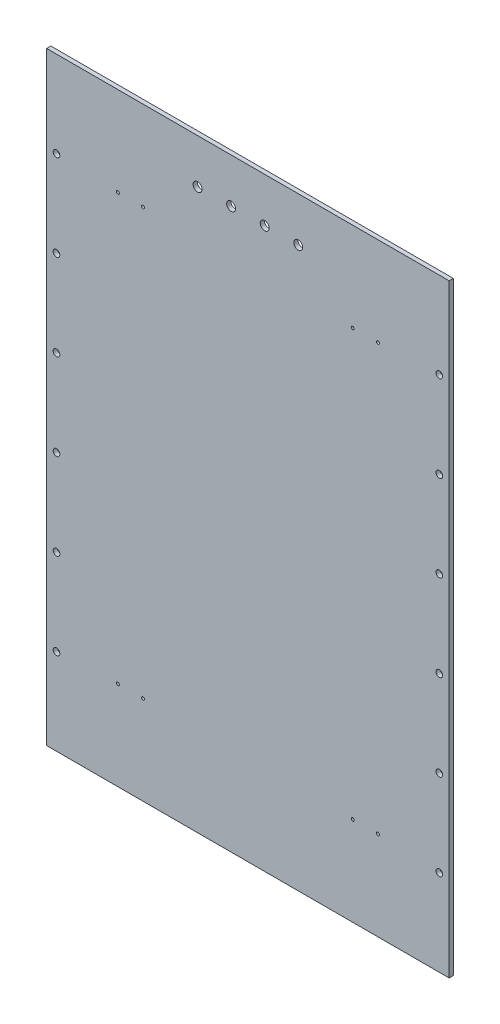
ISO-10303-21;
HEADER;
FILE_DESCRIPTION(('STEP AP214'),'2;1');
FILE_NAME('part.step','',(''),(''),'','','');
FILE_SCHEMA(('AUTOMOTIVE_DESIGN { 1 0 10303 214 1 1 1 1 }'));
ENDSEC;
DATA;
#1=APPLICATION_CONTEXT('core data for automotive mechanical design processes');
#2=APPLICATION_PROTOCOL_DEFINITION('international standard','automotive_design',2000,#1);
#3=PRODUCT_CONTEXT('',#1,'mechanical');
#4=PRODUCT('Part','Part','',(#3));
#5=PRODUCT_RELATED_PRODUCT_CATEGORY('part','',(#4));
#6=PRODUCT_DEFINITION_FORMATION('','',#4);
#7=PRODUCT_DEFINITION_CONTEXT('part definition',#1,'design');
#8=PRODUCT_DEFINITION('design','',#6,#7);
#9=PRODUCT_DEFINITION_SHAPE('','',#8);
#10=(LENGTH_UNIT() NAMED_UNIT(*) SI_UNIT(.MILLI.,.METRE.));
#11=(NAMED_UNIT(*) PLANE_ANGLE_UNIT() SI_UNIT($,.RADIAN.));
#12=(NAMED_UNIT(*) SI_UNIT($,.STERADIAN.) SOLID_ANGLE_UNIT());
#13=UNCERTAINTY_MEASURE_WITH_UNIT(LENGTH_MEASURE(1.E-05),#10,'distance_accuracy_value','');
#14=(GEOMETRIC_REPRESENTATION_CONTEXT(3) GLOBAL_UNCERTAINTY_ASSIGNED_CONTEXT((#13)) GLOBAL_UNIT_ASSIGNED_CONTEXT((#10,
#11,#12)) REPRESENTATION_CONTEXT('',''));
#15=CARTESIAN_POINT('',(0.,0.,0.));
#16=DIRECTION('',(0.,0.,1.));
#17=DIRECTION('',(1.,0.,0.));
#18=AXIS2_PLACEMENT_3D('',#15,#16,#17);
#19=CARTESIAN_POINT('',(0.,0.,3.175));
#20=DIRECTION('',(0.,0.,-1.));
#21=DIRECTION('',(-1.,0.,0.));
#22=AXIS2_PLACEMENT_3D('',#19,#20,#21);
#23=PLANE('',#22);
#24=CARTESIAN_POINT('',(289.8775,-326.571428571429,3.175));
#25=DIRECTION('',(0.,0.,1.));
#26=DIRECTION('',(1.,0.,0.));
#27=AXIS2_PLACEMENT_3D('',#24,#25,#26);
#28=CIRCLE('',#27,5.04189999999999);
#29=CARTESIAN_POINT('',(294.9194,-326.571428571429,3.175));
#30=VERTEX_POINT('',#29);
#31=EDGE_CURVE('E193',#30,#30,#28,.T.);
#32=ORIENTED_EDGE('',*,*,#31,.F.);
#33=EDGE_LOOP('',(#32));
#34=FACE_BOUND('',#33,.T.);
#35=CARTESIAN_POINT('',(76.2000000000001,389.892639342968,3.175));
#36=DIRECTION('',(0.,0.,-1.));
#37=DIRECTION('',(-1.,0.,0.));
#38=AXIS2_PLACEMENT_3D('',#35,#36,#37);
#39=CIRCLE('',#38,6.74624000000001);
#40=CARTESIAN_POINT('',(69.4537600000001,389.892639342968,3.175));
#41=VERTEX_POINT('',#40);
#42=EDGE_CURVE('E166',#41,#41,#39,.T.);
#43=ORIENTED_EDGE('',*,*,#42,.T.);
#44=EDGE_LOOP('',(#43));
#45=FACE_BOUND('',#44,.T.);
#46=CARTESIAN_POINT('',(-25.3999999999999,389.892639342968,3.175));
#47=DIRECTION('',(0.,0.,-1.));
#48=DIRECTION('',(-1.,0.,0.));
#49=AXIS2_PLACEMENT_3D('',#46,#47,#48);
#50=CIRCLE('',#49,6.74623999999999);
#51=CARTESIAN_POINT('',(-32.1462399999999,389.892639342968,3.175));
#52=VERTEX_POINT('',#51);
#53=EDGE_CURVE('E169',#52,#52,#50,.T.);
#54=ORIENTED_EDGE('',*,*,#53,.T.);
#55=EDGE_LOOP('',(#54));
#56=FACE_BOUND('',#55,.T.);
#57=CARTESIAN_POINT('',(25.4000000000001,389.892639342968,3.175));
#58=DIRECTION('',(0.,0.,-1.));
#59=DIRECTION('',(-1.,0.,0.));
#60=AXIS2_PLACEMENT_3D('',#57,#58,#59);
#61=CIRCLE('',#60,6.74623999999999);
#62=CARTESIAN_POINT('',(18.6537600000001,389.892639342968,3.175));
#63=VERTEX_POINT('',#62);
#64=EDGE_CURVE('E172',#63,#63,#61,.T.);
#65=ORIENTED_EDGE('',*,*,#64,.T.);
#66=EDGE_LOOP('',(#65));
#67=FACE_BOUND('',#66,.T.);
#68=CARTESIAN_POINT('',(-76.1999999999999,389.892639342968,3.175));
#69=DIRECTION('',(0.,0.,-1.));
#70=DIRECTION('',(-1.,0.,0.));
#71=AXIS2_PLACEMENT_3D('',#68,#69,#70);
#72=CIRCLE('',#71,6.74624);
#73=CARTESIAN_POINT('',(-82.9462399999999,389.892639342968,3.175));
#74=VERTEX_POINT('',#73);
#75=EDGE_CURVE('E175',#74,#74,#72,.T.);
#76=ORIENTED_EDGE('',*,*,#75,.T.);
#77=EDGE_LOOP('',(#76));
#78=FACE_BOUND('',#77,.T.);
#79=CARTESIAN_POINT('',(-196.85,-322.2625,3.175));
#80=DIRECTION('',(0.,0.,1.));
#81=DIRECTION('',(1.,0.,0.));
#82=AXIS2_PLACEMENT_3D('',#79,#80,#81);
#83=CIRCLE('',#82,2.2479);
#84=CARTESIAN_POINT('',(-194.6021,-322.2625,3.175));
#85=VERTEX_POINT('',#84);
#86=EDGE_CURVE('E163',#85,#85,#83,.T.);
#87=ORIENTED_EDGE('',*,*,#86,.F.);
#88=EDGE_LOOP('',(#87));
#89=FACE_BOUND('',#88,.T.);
#90=CARTESIAN_POINT('',(-158.75,-322.2625,3.175));
#91=DIRECTION('',(0.,0.,1.));
#92=DIRECTION('',(1.,0.,0.));
#93=AXIS2_PLACEMENT_3D('',#90,#91,#92);
#94=CIRCLE('',#93,2.2479);
#95=CARTESIAN_POINT('',(-156.5021,-322.2625,3.175));
#96=VERTEX_POINT('',#95);
#97=EDGE_CURVE('E157',#96,#96,#94,.T.);
#98=ORIENTED_EDGE('',*,*,#97,.F.);
#99=EDGE_LOOP('',(#98));
#100=FACE_BOUND('',#99,.T.);
#101=CARTESIAN_POINT('',(196.85,-322.2625,3.175));
#102=DIRECTION('',(0.,0.,1.));
#103=DIRECTION('',(1.,0.,0.));
#104=AXIS2_PLACEMENT_3D('',#101,#102,#103);
#105=CIRCLE('',#104,2.2479);
#106=CARTESIAN_POINT('',(199.0979,-322.2625,3.175));
#107=VERTEX_POINT('',#106);
#108=EDGE_CURVE('E151',#107,#107,#105,.T.);
#109=ORIENTED_EDGE('',*,*,#108,.F.);
#110=EDGE_LOOP('',(#109));
#111=FACE_BOUND('',#110,.T.);
#112=CARTESIAN_POINT('',(158.75,-322.2625,3.175));
#113=DIRECTION('',(0.,0.,1.));
#114=DIRECTION('',(1.,0.,0.));
#115=AXIS2_PLACEMENT_3D('',#112,#113,#114);
#116=CIRCLE('',#115,2.2479);
#117=CARTESIAN_POINT('',(160.9979,-322.2625,3.175));
#118=VERTEX_POINT('',#117);
#119=EDGE_CURVE('E145',#118,#118,#116,.T.);
#120=ORIENTED_EDGE('',*,*,#119,.F.);
#121=EDGE_LOOP('',(#120));
#122=FACE_BOUND('',#121,.T.);
#123=CARTESIAN_POINT('',(158.75,322.2625,3.175));
#124=DIRECTION('',(0.,0.,1.));
#125=DIRECTION('',(1.,0.,0.));
#126=AXIS2_PLACEMENT_3D('',#123,#124,#125);
#127=CIRCLE('',#126,2.2479);
#128=CARTESIAN_POINT('',(160.9979,322.2625,3.175));
#129=VERTEX_POINT('',#128);
#130=EDGE_CURVE('E139',#129,#129,#127,.T.);
#131=ORIENTED_EDGE('',*,*,#130,.F.);
#132=EDGE_LOOP('',(#131));
#133=FACE_BOUND('',#132,.T.);
#134=CARTESIAN_POINT('',(196.85,322.2625,3.175));
#135=DIRECTION('',(0.,0.,1.));
#136=DIRECTION('',(1.,0.,0.));
#137=AXIS2_PLACEMENT_3D('',#134,#135,#136);
#138=CIRCLE('',#137,2.2479);
#139=CARTESIAN_POINT('',(199.0979,322.2625,3.175));
#140=VERTEX_POINT('',#139);
#141=EDGE_CURVE('E133',#140,#140,#138,.T.);
#142=ORIENTED_EDGE('',*,*,#141,.F.);
#143=EDGE_LOOP('',(#142));
#144=FACE_BOUND('',#143,.T.);
#145=CARTESIAN_POINT('',(-158.75,322.2625,3.175));
#146=DIRECTION('',(0.,0.,1.));
#147=DIRECTION('',(1.,0.,0.));
#148=AXIS2_PLACEMENT_3D('',#145,#146,#147);
#149=CIRCLE('',#148,2.2479);
#150=CARTESIAN_POINT('',(-156.5021,322.2625,3.175));
#151=VERTEX_POINT('',#150);
#152=EDGE_CURVE('E127',#151,#151,#149,.T.);
#153=ORIENTED_EDGE('',*,*,#152,.F.);
#154=EDGE_LOOP('',(#153));
#155=FACE_BOUND('',#154,.T.);
#156=CARTESIAN_POINT('',(-196.85,322.2625,3.175));
#157=DIRECTION('',(0.,0.,1.));
#158=DIRECTION('',(1.,0.,0.));
#159=AXIS2_PLACEMENT_3D('',#156,#157,#158);
#160=CIRCLE('',#159,2.2479);
#161=CARTESIAN_POINT('',(-194.6021,322.2625,3.175));
#162=VERTEX_POINT('',#161);
#163=EDGE_CURVE('E121',#162,#162,#160,.T.);
#164=ORIENTED_EDGE('',*,*,#163,.F.);
#165=EDGE_LOOP('',(#164));
#166=FACE_BOUND('',#165,.T.);
#167=DIRECTION('',(0.,1.,0.));
#168=VECTOR('',#167,1.);
#169=CARTESIAN_POINT('',(304.8,-457.2,3.175));
#170=LINE('',#169,#168);
#171=CARTESIAN_POINT('',(304.8,-457.2,3.175));
#172=VERTEX_POINT('',#171);
#173=CARTESIAN_POINT('',(304.8,457.2,3.175));
#174=VERTEX_POINT('',#173);
#175=EDGE_CURVE('E93',#172,#174,#170,.T.);
#176=ORIENTED_EDGE('',*,*,#175,.T.);
#177=DIRECTION('',(-1.,0.,0.));
#178=VECTOR('',#177,1.);
#179=CARTESIAN_POINT('',(-304.8,457.2,3.175));
#180=LINE('',#179,#178);
#181=CARTESIAN_POINT('',(-304.8,457.2,3.175));
#182=VERTEX_POINT('',#181);
#183=EDGE_CURVE('E88',#174,#182,#180,.T.);
#184=ORIENTED_EDGE('',*,*,#183,.T.);
#185=DIRECTION('',(0.,-1.,0.));
#186=VECTOR('',#185,1.);
#187=CARTESIAN_POINT('',(-304.8,-457.2,3.175));
#188=LINE('',#187,#186);
#189=CARTESIAN_POINT('',(-304.8,-457.2,3.175));
#190=VERTEX_POINT('',#189);
#191=EDGE_CURVE('E91',#182,#190,#188,.T.);
#192=ORIENTED_EDGE('',*,*,#191,.T.);
#193=DIRECTION('',(1.,0.,0.));
#194=VECTOR('',#193,1.);
#195=CARTESIAN_POINT('',(-304.8,-457.2,3.175));
#196=LINE('',#195,#194);
#197=EDGE_CURVE('E58',#190,#172,#196,.T.);
#198=ORIENTED_EDGE('',*,*,#197,.T.);
#199=EDGE_LOOP('',(#176,#184,#192,#198));
#200=FACE_BOUND('',#199,.T.);
#201=CARTESIAN_POINT('',(289.8775,-195.942857215429,3.175));
#202=DIRECTION('',(0.,0.,1.));
#203=DIRECTION('',(1.,0.,0.));
#204=AXIS2_PLACEMENT_3D('',#201,#202,#203);
#205=CIRCLE('',#204,5.04189999999999);
#206=CARTESIAN_POINT('',(294.9194,-195.942857215429,3.175));
#207=VERTEX_POINT('',#206);
#208=EDGE_CURVE('E199',#207,#207,#205,.T.);
#209=ORIENTED_EDGE('',*,*,#208,.F.);
#210=EDGE_LOOP('',(#209));
#211=FACE_BOUND('',#210,.T.);
#212=CARTESIAN_POINT('',(289.8775,-65.3142858594288,3.175));
#213=DIRECTION('',(0.,0.,1.));
#214=DIRECTION('',(1.,0.,0.));
#215=AXIS2_PLACEMENT_3D('',#212,#213,#214);
#216=CIRCLE('',#215,5.04189999999999);
#217=CARTESIAN_POINT('',(294.9194,-65.3142858594288,3.175));
#218=VERTEX_POINT('',#217);
#219=EDGE_CURVE('E205',#218,#218,#216,.T.);
#220=ORIENTED_EDGE('',*,*,#219,.F.);
#221=EDGE_LOOP('',(#220));
#222=FACE_BOUND('',#221,.T.);
#223=CARTESIAN_POINT('',(289.8775,65.3142854965713,3.175));
#224=DIRECTION('',(0.,0.,1.));
#225=DIRECTION('',(1.,0.,0.));
#226=AXIS2_PLACEMENT_3D('',#223,#224,#225);
#227=CIRCLE('',#226,5.04189999999999);
#228=CARTESIAN_POINT('',(294.9194,65.3142854965713,3.175));
#229=VERTEX_POINT('',#228);
#230=EDGE_CURVE('E211',#229,#229,#227,.T.);
#231=ORIENTED_EDGE('',*,*,#230,.F.);
#232=EDGE_LOOP('',(#231));
#233=FACE_BOUND('',#232,.T.);
#234=CARTESIAN_POINT('',(289.8775,195.942856852571,3.175));
#235=DIRECTION('',(0.,0.,1.));
#236=DIRECTION('',(1.,0.,0.));
#237=AXIS2_PLACEMENT_3D('',#234,#235,#236);
#238=CIRCLE('',#237,5.04189999999999);
#239=CARTESIAN_POINT('',(294.9194,195.942856852571,3.175));
#240=VERTEX_POINT('',#239);
#241=EDGE_CURVE('E217',#240,#240,#238,.T.);
#242=ORIENTED_EDGE('',*,*,#241,.F.);
#243=EDGE_LOOP('',(#242));
#244=FACE_BOUND('',#243,.T.);
#245=CARTESIAN_POINT('',(289.8775,326.571428208571,3.175));
#246=DIRECTION('',(0.,0.,1.));
#247=DIRECTION('',(1.,0.,0.));
#248=AXIS2_PLACEMENT_3D('',#245,#246,#247);
#249=CIRCLE('',#248,5.04189999999999);
#250=CARTESIAN_POINT('',(294.9194,326.571428208571,3.175));
#251=VERTEX_POINT('',#250);
#252=EDGE_CURVE('E223',#251,#251,#249,.T.);
#253=ORIENTED_EDGE('',*,*,#252,.F.);
#254=EDGE_LOOP('',(#253));
#255=FACE_BOUND('',#254,.T.);
#256=CARTESIAN_POINT('',(-289.8775,326.571428208571,3.175));
#257=DIRECTION('',(0.,0.,1.));
#258=DIRECTION('',(1.,0.,0.));
#259=AXIS2_PLACEMENT_3D('',#256,#257,#258);
#260=CIRCLE('',#259,5.04189999999999);
#261=CARTESIAN_POINT('',(-284.8356,326.571428208571,3.175));
#262=VERTEX_POINT('',#261);
#263=EDGE_CURVE('E229',#262,#262,#260,.T.);
#264=ORIENTED_EDGE('',*,*,#263,.F.);
#265=EDGE_LOOP('',(#264));
#266=FACE_BOUND('',#265,.T.);
#267=CARTESIAN_POINT('',(-289.8775,195.942856852571,3.175));
#268=DIRECTION('',(0.,0.,1.));
#269=DIRECTION('',(1.,0.,0.));
#270=AXIS2_PLACEMENT_3D('',#267,#268,#269);
#271=CIRCLE('',#270,5.04189999999999);
#272=CARTESIAN_POINT('',(-284.8356,195.942856852571,3.175));
#273=VERTEX_POINT('',#272);
#274=EDGE_CURVE('E235',#273,#273,#271,.T.);
#275=ORIENTED_EDGE('',*,*,#274,.F.);
#276=EDGE_LOOP('',(#275));
#277=FACE_BOUND('',#276,.T.);
#278=CARTESIAN_POINT('',(-289.8775,65.3142854965714,3.175));
#279=DIRECTION('',(0.,0.,1.));
#280=DIRECTION('',(1.,0.,0.));
#281=AXIS2_PLACEMENT_3D('',#278,#279,#280);
#282=CIRCLE('',#281,5.04189999999999);
#283=CARTESIAN_POINT('',(-284.8356,65.3142854965714,3.175));
#284=VERTEX_POINT('',#283);
#285=EDGE_CURVE('E241',#284,#284,#282,.T.);
#286=ORIENTED_EDGE('',*,*,#285,.F.);
#287=EDGE_LOOP('',(#286));
#288=FACE_BOUND('',#287,.T.);
#289=CARTESIAN_POINT('',(-289.8775,-65.3142858594286,3.175));
#290=DIRECTION('',(0.,0.,1.));
#291=DIRECTION('',(1.,0.,0.));
#292=AXIS2_PLACEMENT_3D('',#289,#290,#291);
#293=CIRCLE('',#292,5.04189999999999);
#294=CARTESIAN_POINT('',(-284.8356,-65.3142858594286,3.175));
#295=VERTEX_POINT('',#294);
#296=EDGE_CURVE('E247',#295,#295,#293,.T.);
#297=ORIENTED_EDGE('',*,*,#296,.F.);
#298=EDGE_LOOP('',(#297));
#299=FACE_BOUND('',#298,.T.);
#300=CARTESIAN_POINT('',(-289.8775,-195.942857215429,3.175));
#301=DIRECTION('',(0.,0.,1.));
#302=DIRECTION('',(1.,0.,0.));
#303=AXIS2_PLACEMENT_3D('',#300,#301,#302);
#304=CIRCLE('',#303,5.04189999999999);
#305=CARTESIAN_POINT('',(-284.8356,-195.942857215429,3.175));
#306=VERTEX_POINT('',#305);
#307=EDGE_CURVE('E253',#306,#306,#304,.T.);
#308=ORIENTED_EDGE('',*,*,#307,.F.);
#309=EDGE_LOOP('',(#308));
#310=FACE_BOUND('',#309,.T.);
#311=CARTESIAN_POINT('',(-289.8775,-326.571428571429,3.175));
#312=DIRECTION('',(0.,0.,1.));
#313=DIRECTION('',(1.,0.,0.));
#314=AXIS2_PLACEMENT_3D('',#311,#312,#313);
#315=CIRCLE('',#314,5.04189999999999);
#316=CARTESIAN_POINT('',(-284.8356,-326.571428571429,3.175));
#317=VERTEX_POINT('',#316);
#318=EDGE_CURVE('E259',#317,#317,#315,.T.);
#319=ORIENTED_EDGE('',*,*,#318,.F.);
#320=EDGE_LOOP('',(#319));
#321=FACE_BOUND('',#320,.T.);
#322=ADVANCED_FACE('F41',(#34,#45,#56,#67,#78,#89,#100,#111,#122,#133,#144,#155,#166,#200,#211,
#222,#233,#244,#255,#266,#277,#288,#299,#310,#321),#23,.F.);
#323=CARTESIAN_POINT('',(304.8,-457.2,3.175));
#324=DIRECTION('',(-1.,0.,0.));
#325=DIRECTION('',(0.,0.,1.));
#326=AXIS2_PLACEMENT_3D('',#323,#324,#325);
#327=PLANE('',#326);
#328=DIRECTION('',(0.,1.,0.));
#329=VECTOR('',#328,1.);
#330=CARTESIAN_POINT('',(304.8,-457.2,-3.175));
#331=LINE('',#330,#329);
#332=CARTESIAN_POINT('',(304.8,-457.2,-3.175));
#333=VERTEX_POINT('',#332);
#334=CARTESIAN_POINT('',(304.8,457.2,-3.175));
#335=VERTEX_POINT('',#334);
#336=EDGE_CURVE('E105',#333,#335,#331,.T.);
#337=ORIENTED_EDGE('',*,*,#336,.T.);
#338=DIRECTION('',(0.,0.,-1.));
#339=VECTOR('',#338,1.);
#340=CARTESIAN_POINT('',(304.8,457.2,3.175));
#341=LINE('',#340,#339);
#342=EDGE_CURVE('E11',#174,#335,#341,.T.);
#343=ORIENTED_EDGE('',*,*,#342,.F.);
#344=ORIENTED_EDGE('',*,*,#175,.F.);
#345=DIRECTION('',(0.,0.,-1.));
#346=VECTOR('',#345,1.);
#347=CARTESIAN_POINT('',(304.8,-457.2,3.175));
#348=LINE('',#347,#346);
#349=EDGE_CURVE('E101',#172,#333,#348,.T.);
#350=ORIENTED_EDGE('',*,*,#349,.T.);
#351=EDGE_LOOP('',(#337,#343,#344,#350));
#352=FACE_BOUND('',#351,.T.);
#353=ADVANCED_FACE('F43',(#352),#327,.F.);
#354=CARTESIAN_POINT('',(-304.8,457.2,3.175));
#355=DIRECTION('',(0.,-1.,0.));
#356=DIRECTION('',(0.,0.,-1.));
#357=AXIS2_PLACEMENT_3D('',#354,#355,#356);
#358=PLANE('',#357);
#359=DIRECTION('',(-1.,0.,0.));
#360=VECTOR('',#359,1.);
#361=CARTESIAN_POINT('',(-304.8,457.2,-3.175));
#362=LINE('',#361,#360);
#363=CARTESIAN_POINT('',(-304.8,457.2,-3.175));
#364=VERTEX_POINT('',#363);
#365=EDGE_CURVE('E97',#335,#364,#362,.T.);
#366=ORIENTED_EDGE('',*,*,#365,.T.);
#367=DIRECTION('',(0.,0.,-1.));
#368=VECTOR('',#367,1.);
#369=CARTESIAN_POINT('',(-304.8,457.2,3.175));
#370=LINE('',#369,#368);
#371=EDGE_CURVE('E50',#182,#364,#370,.T.);
#372=ORIENTED_EDGE('',*,*,#371,.F.);
#373=ORIENTED_EDGE('',*,*,#183,.F.);
#374=ORIENTED_EDGE('',*,*,#342,.T.);
#375=EDGE_LOOP('',(#366,#372,#373,#374));
#376=FACE_BOUND('',#375,.T.);
#377=ADVANCED_FACE('F96',(#376),#358,.F.);
#378=CARTESIAN_POINT('',(-304.8,-457.2,3.175));
#379=DIRECTION('',(1.,0.,0.));
#380=DIRECTION('',(0.,0.,-1.));
#381=AXIS2_PLACEMENT_3D('',#378,#379,#380);
#382=PLANE('',#381);
#383=DIRECTION('',(0.,-1.,0.));
#384=VECTOR('',#383,1.);
#385=CARTESIAN_POINT('',(-304.8,-457.2,-3.175));
#386=LINE('',#385,#384);
#387=CARTESIAN_POINT('',(-304.8,-457.2,-3.175));
#388=VERTEX_POINT('',#387);
#389=EDGE_CURVE('E75',#364,#388,#386,.T.);
#390=ORIENTED_EDGE('',*,*,#389,.T.);
#391=DIRECTION('',(0.,0.,-1.));
#392=VECTOR('',#391,1.);
#393=CARTESIAN_POINT('',(-304.8,-457.2,3.175));
#394=LINE('',#393,#392);
#395=EDGE_CURVE('E98',#190,#388,#394,.T.);
#396=ORIENTED_EDGE('',*,*,#395,.F.);
#397=ORIENTED_EDGE('',*,*,#191,.F.);
#398=ORIENTED_EDGE('',*,*,#371,.T.);
#399=EDGE_LOOP('',(#390,#396,#397,#398));
#400=FACE_BOUND('',#399,.T.);
#401=ADVANCED_FACE('F99',(#400),#382,.F.);
#402=CARTESIAN_POINT('',(-304.8,-457.2,3.175));
#403=DIRECTION('',(0.,1.,0.));
#404=DIRECTION('',(0.,0.,1.));
#405=AXIS2_PLACEMENT_3D('',#402,#403,#404);
#406=PLANE('',#405);
#407=DIRECTION('',(1.,0.,0.));
#408=VECTOR('',#407,1.);
#409=CARTESIAN_POINT('',(-304.8,-457.2,-3.175));
#410=LINE('',#409,#408);
#411=EDGE_CURVE('E81',#388,#333,#410,.T.);
#412=ORIENTED_EDGE('',*,*,#411,.T.);
#413=ORIENTED_EDGE('',*,*,#349,.F.);
#414=ORIENTED_EDGE('',*,*,#197,.F.);
#415=ORIENTED_EDGE('',*,*,#395,.T.);
#416=EDGE_LOOP('',(#412,#413,#414,#415));
#417=FACE_BOUND('',#416,.T.);
#418=ADVANCED_FACE('F113',(#417),#406,.F.);
#419=CARTESIAN_POINT('',(0.,0.,-3.175));
#420=DIRECTION('',(0.,0.,-1.));
#421=DIRECTION('',(-1.,0.,0.));
#422=AXIS2_PLACEMENT_3D('',#419,#420,#421);
#423=PLANE('',#422);
#424=CARTESIAN_POINT('',(-289.8775,-326.571428571429,-3.175));
#425=DIRECTION('',(0.,0.,-1.));
#426=DIRECTION('',(-1.,0.,0.));
#427=AXIS2_PLACEMENT_3D('',#424,#425,#426);
#428=CIRCLE('',#427,5.04189999999999);
#429=CARTESIAN_POINT('',(-294.9194,-326.571428571429,-3.175));
#430=VERTEX_POINT('',#429);
#431=EDGE_CURVE('E256',#430,#430,#428,.T.);
#432=ORIENTED_EDGE('',*,*,#431,.F.);
#433=EDGE_LOOP('',(#432));
#434=FACE_BOUND('',#433,.T.);
#435=CARTESIAN_POINT('',(-289.8775,-195.942857215429,-3.175));
#436=DIRECTION('',(0.,0.,-1.));
#437=DIRECTION('',(-1.,0.,0.));
#438=AXIS2_PLACEMENT_3D('',#435,#436,#437);
#439=CIRCLE('',#438,5.04189999999999);
#440=CARTESIAN_POINT('',(-294.9194,-195.942857215429,-3.175));
#441=VERTEX_POINT('',#440);
#442=EDGE_CURVE('E250',#441,#441,#439,.T.);
#443=ORIENTED_EDGE('',*,*,#442,.F.);
#444=EDGE_LOOP('',(#443));
#445=FACE_BOUND('',#444,.T.);
#446=CARTESIAN_POINT('',(-289.8775,-65.3142858594286,-3.175));
#447=DIRECTION('',(0.,0.,-1.));
#448=DIRECTION('',(-1.,0.,0.));
#449=AXIS2_PLACEMENT_3D('',#446,#447,#448);
#450=CIRCLE('',#449,5.04189999999999);
#451=CARTESIAN_POINT('',(-294.9194,-65.3142858594286,-3.175));
#452=VERTEX_POINT('',#451);
#453=EDGE_CURVE('E244',#452,#452,#450,.T.);
#454=ORIENTED_EDGE('',*,*,#453,.F.);
#455=EDGE_LOOP('',(#454));
#456=FACE_BOUND('',#455,.T.);
#457=CARTESIAN_POINT('',(-289.8775,65.3142854965714,-3.175));
#458=DIRECTION('',(0.,0.,-1.));
#459=DIRECTION('',(-1.,0.,0.));
#460=AXIS2_PLACEMENT_3D('',#457,#458,#459);
#461=CIRCLE('',#460,5.04189999999999);
#462=CARTESIAN_POINT('',(-294.9194,65.3142854965714,-3.175));
#463=VERTEX_POINT('',#462);
#464=EDGE_CURVE('E238',#463,#463,#461,.T.);
#465=ORIENTED_EDGE('',*,*,#464,.F.);
#466=EDGE_LOOP('',(#465));
#467=FACE_BOUND('',#466,.T.);
#468=CARTESIAN_POINT('',(-289.8775,195.942856852571,-3.175));
#469=DIRECTION('',(0.,0.,-1.));
#470=DIRECTION('',(-1.,0.,0.));
#471=AXIS2_PLACEMENT_3D('',#468,#469,#470);
#472=CIRCLE('',#471,5.04189999999999);
#473=CARTESIAN_POINT('',(-294.9194,195.942856852571,-3.175));
#474=VERTEX_POINT('',#473);
#475=EDGE_CURVE('E232',#474,#474,#472,.T.);
#476=ORIENTED_EDGE('',*,*,#475,.F.);
#477=EDGE_LOOP('',(#476));
#478=FACE_BOUND('',#477,.T.);
#479=CARTESIAN_POINT('',(-289.8775,326.571428208571,-3.175));
#480=DIRECTION('',(0.,0.,-1.));
#481=DIRECTION('',(-1.,0.,0.));
#482=AXIS2_PLACEMENT_3D('',#479,#480,#481);
#483=CIRCLE('',#482,5.04189999999999);
#484=CARTESIAN_POINT('',(-294.9194,326.571428208571,-3.175));
#485=VERTEX_POINT('',#484);
#486=EDGE_CURVE('E226',#485,#485,#483,.T.);
#487=ORIENTED_EDGE('',*,*,#486,.F.);
#488=EDGE_LOOP('',(#487));
#489=FACE_BOUND('',#488,.T.);
#490=CARTESIAN_POINT('',(289.8775,326.571428208571,-3.175));
#491=DIRECTION('',(0.,0.,-1.));
#492=DIRECTION('',(-1.,0.,0.));
#493=AXIS2_PLACEMENT_3D('',#490,#491,#492);
#494=CIRCLE('',#493,5.04189999999999);
#495=CARTESIAN_POINT('',(284.8356,326.571428208571,-3.175));
#496=VERTEX_POINT('',#495);
#497=EDGE_CURVE('E220',#496,#496,#494,.T.);
#498=ORIENTED_EDGE('',*,*,#497,.F.);
#499=EDGE_LOOP('',(#498));
#500=FACE_BOUND('',#499,.T.);
#501=CARTESIAN_POINT('',(289.8775,195.942856852571,-3.175));
#502=DIRECTION('',(0.,0.,-1.));
#503=DIRECTION('',(-1.,0.,0.));
#504=AXIS2_PLACEMENT_3D('',#501,#502,#503);
#505=CIRCLE('',#504,5.04189999999999);
#506=CARTESIAN_POINT('',(284.8356,195.942856852571,-3.175));
#507=VERTEX_POINT('',#506);
#508=EDGE_CURVE('E214',#507,#507,#505,.T.);
#509=ORIENTED_EDGE('',*,*,#508,.F.);
#510=EDGE_LOOP('',(#509));
#511=FACE_BOUND('',#510,.T.);
#512=CARTESIAN_POINT('',(289.8775,65.3142854965713,-3.175));
#513=DIRECTION('',(0.,0.,-1.));
#514=DIRECTION('',(-1.,0.,0.));
#515=AXIS2_PLACEMENT_3D('',#512,#513,#514);
#516=CIRCLE('',#515,5.04189999999999);
#517=CARTESIAN_POINT('',(284.8356,65.3142854965713,-3.175));
#518=VERTEX_POINT('',#517);
#519=EDGE_CURVE('E208',#518,#518,#516,.T.);
#520=ORIENTED_EDGE('',*,*,#519,.F.);
#521=EDGE_LOOP('',(#520));
#522=FACE_BOUND('',#521,.T.);
#523=CARTESIAN_POINT('',(289.8775,-65.3142858594288,-3.175));
#524=DIRECTION('',(0.,0.,-1.));
#525=DIRECTION('',(-1.,0.,0.));
#526=AXIS2_PLACEMENT_3D('',#523,#524,#525);
#527=CIRCLE('',#526,5.04189999999999);
#528=CARTESIAN_POINT('',(284.8356,-65.3142858594288,-3.175));
#529=VERTEX_POINT('',#528);
#530=EDGE_CURVE('E202',#529,#529,#527,.T.);
#531=ORIENTED_EDGE('',*,*,#530,.F.);
#532=EDGE_LOOP('',(#531));
#533=FACE_BOUND('',#532,.T.);
#534=CARTESIAN_POINT('',(289.8775,-195.942857215429,-3.175));
#535=DIRECTION('',(0.,0.,-1.));
#536=DIRECTION('',(-1.,0.,0.));
#537=AXIS2_PLACEMENT_3D('',#534,#535,#536);
#538=CIRCLE('',#537,5.04189999999999);
#539=CARTESIAN_POINT('',(284.8356,-195.942857215429,-3.175));
#540=VERTEX_POINT('',#539);
#541=EDGE_CURVE('E196',#540,#540,#538,.T.);
#542=ORIENTED_EDGE('',*,*,#541,.F.);
#543=EDGE_LOOP('',(#542));
#544=FACE_BOUND('',#543,.T.);
#545=CARTESIAN_POINT('',(289.8775,-326.571428571429,-3.175));
#546=DIRECTION('',(0.,0.,-1.));
#547=DIRECTION('',(-1.,0.,0.));
#548=AXIS2_PLACEMENT_3D('',#545,#546,#547);
#549=CIRCLE('',#548,5.04189999999999);
#550=CARTESIAN_POINT('',(284.8356,-326.571428571429,-3.175));
#551=VERTEX_POINT('',#550);
#552=EDGE_CURVE('E183',#551,#551,#549,.T.);
#553=ORIENTED_EDGE('',*,*,#552,.F.);
#554=EDGE_LOOP('',(#553));
#555=FACE_BOUND('',#554,.T.);
#556=CARTESIAN_POINT('',(76.2000000000001,389.892639342968,-3.175));
#557=DIRECTION('',(0.,0.,1.));
#558=DIRECTION('',(1.,0.,0.));
#559=AXIS2_PLACEMENT_3D('',#556,#557,#558);
#560=CIRCLE('',#559,6.74624000000001);
#561=CARTESIAN_POINT('',(82.9462400000001,389.892639342968,-3.175));
#562=VERTEX_POINT('',#561);
#563=EDGE_CURVE('E178',#562,#562,#560,.T.);
#564=ORIENTED_EDGE('',*,*,#563,.T.);
#565=EDGE_LOOP('',(#564));
#566=FACE_BOUND('',#565,.T.);
#567=CARTESIAN_POINT('',(-25.3999999999999,389.892639342968,-3.175));
#568=DIRECTION('',(0.,0.,1.));
#569=DIRECTION('',(1.,0.,0.));
#570=AXIS2_PLACEMENT_3D('',#567,#568,#569);
#571=CIRCLE('',#570,6.74623999999999);
#572=CARTESIAN_POINT('',(-18.6537599999999,389.892639342968,-3.175));
#573=VERTEX_POINT('',#572);
#574=EDGE_CURVE('E186',#573,#573,#571,.T.);
#575=ORIENTED_EDGE('',*,*,#574,.T.);
#576=EDGE_LOOP('',(#575));
#577=FACE_BOUND('',#576,.T.);
#578=CARTESIAN_POINT('',(25.4000000000001,389.892639342968,-3.175));
#579=DIRECTION('',(0.,0.,1.));
#580=DIRECTION('',(1.,0.,0.));
#581=AXIS2_PLACEMENT_3D('',#578,#579,#580);
#582=CIRCLE('',#581,6.74623999999999);
#583=CARTESIAN_POINT('',(32.1462400000001,389.892639342968,-3.175));
#584=VERTEX_POINT('',#583);
#585=EDGE_CURVE('E182',#584,#584,#582,.T.);
#586=ORIENTED_EDGE('',*,*,#585,.T.);
#587=EDGE_LOOP('',(#586));
#588=FACE_BOUND('',#587,.T.);
#589=CARTESIAN_POINT('',(-76.1999999999999,389.892639342968,-3.175));
#590=DIRECTION('',(0.,0.,1.));
#591=DIRECTION('',(1.,0.,0.));
#592=AXIS2_PLACEMENT_3D('',#589,#590,#591);
#593=CIRCLE('',#592,6.74624);
#594=CARTESIAN_POINT('',(-69.4537599999999,389.892639342968,-3.175));
#595=VERTEX_POINT('',#594);
#596=EDGE_CURVE('E179',#595,#595,#593,.T.);
#597=ORIENTED_EDGE('',*,*,#596,.T.);
#598=EDGE_LOOP('',(#597));
#599=FACE_BOUND('',#598,.T.);
#600=CARTESIAN_POINT('',(-196.85,-322.2625,-3.175));
#601=DIRECTION('',(0.,0.,-1.));
#602=DIRECTION('',(-1.,0.,0.));
#603=AXIS2_PLACEMENT_3D('',#600,#601,#602);
#604=CIRCLE('',#603,2.2479);
#605=CARTESIAN_POINT('',(-199.0979,-322.2625,-3.175));
#606=VERTEX_POINT('',#605);
#607=EDGE_CURVE('E160',#606,#606,#604,.T.);
#608=ORIENTED_EDGE('',*,*,#607,.F.);
#609=EDGE_LOOP('',(#608));
#610=FACE_BOUND('',#609,.T.);
#611=CARTESIAN_POINT('',(-158.75,-322.2625,-3.175));
#612=DIRECTION('',(0.,0.,-1.));
#613=DIRECTION('',(-1.,0.,0.));
#614=AXIS2_PLACEMENT_3D('',#611,#612,#613);
#615=CIRCLE('',#614,2.2479);
#616=CARTESIAN_POINT('',(-160.9979,-322.2625,-3.175));
#617=VERTEX_POINT('',#616);
#618=EDGE_CURVE('E154',#617,#617,#615,.T.);
#619=ORIENTED_EDGE('',*,*,#618,.F.);
#620=EDGE_LOOP('',(#619));
#621=FACE_BOUND('',#620,.T.);
#622=CARTESIAN_POINT('',(196.85,-322.2625,-3.175));
#623=DIRECTION('',(0.,0.,-1.));
#624=DIRECTION('',(-1.,0.,0.));
#625=AXIS2_PLACEMENT_3D('',#622,#623,#624);
#626=CIRCLE('',#625,2.2479);
#627=CARTESIAN_POINT('',(194.6021,-322.2625,-3.175));
#628=VERTEX_POINT('',#627);
#629=EDGE_CURVE('E148',#628,#628,#626,.T.);
#630=ORIENTED_EDGE('',*,*,#629,.F.);
#631=EDGE_LOOP('',(#630));
#632=FACE_BOUND('',#631,.T.);
#633=CARTESIAN_POINT('',(158.75,-322.2625,-3.175));
#634=DIRECTION('',(0.,0.,-1.));
#635=DIRECTION('',(-1.,0.,0.));
#636=AXIS2_PLACEMENT_3D('',#633,#634,#635);
#637=CIRCLE('',#636,2.2479);
#638=CARTESIAN_POINT('',(156.5021,-322.2625,-3.175));
#639=VERTEX_POINT('',#638);
#640=EDGE_CURVE('E142',#639,#639,#637,.T.);
#641=ORIENTED_EDGE('',*,*,#640,.F.);
#642=EDGE_LOOP('',(#641));
#643=FACE_BOUND('',#642,.T.);
#644=CARTESIAN_POINT('',(158.75,322.2625,-3.175));
#645=DIRECTION('',(0.,0.,-1.));
#646=DIRECTION('',(-1.,0.,0.));
#647=AXIS2_PLACEMENT_3D('',#644,#645,#646);
#648=CIRCLE('',#647,2.2479);
#649=CARTESIAN_POINT('',(156.5021,322.2625,-3.175));
#650=VERTEX_POINT('',#649);
#651=EDGE_CURVE('E136',#650,#650,#648,.T.);
#652=ORIENTED_EDGE('',*,*,#651,.F.);
#653=EDGE_LOOP('',(#652));
#654=FACE_BOUND('',#653,.T.);
#655=CARTESIAN_POINT('',(196.85,322.2625,-3.175));
#656=DIRECTION('',(0.,0.,-1.));
#657=DIRECTION('',(-1.,0.,0.));
#658=AXIS2_PLACEMENT_3D('',#655,#656,#657);
#659=CIRCLE('',#658,2.2479);
#660=CARTESIAN_POINT('',(194.6021,322.2625,-3.175));
#661=VERTEX_POINT('',#660);
#662=EDGE_CURVE('E130',#661,#661,#659,.T.);
#663=ORIENTED_EDGE('',*,*,#662,.F.);
#664=EDGE_LOOP('',(#663));
#665=FACE_BOUND('',#664,.T.);
#666=CARTESIAN_POINT('',(-158.75,322.2625,-3.175));
#667=DIRECTION('',(0.,0.,-1.));
#668=DIRECTION('',(-1.,0.,0.));
#669=AXIS2_PLACEMENT_3D('',#666,#667,#668);
#670=CIRCLE('',#669,2.2479);
#671=CARTESIAN_POINT('',(-160.9979,322.2625,-3.175));
#672=VERTEX_POINT('',#671);
#673=EDGE_CURVE('E124',#672,#672,#670,.T.);
#674=ORIENTED_EDGE('',*,*,#673,.F.);
#675=EDGE_LOOP('',(#674));
#676=FACE_BOUND('',#675,.T.);
#677=CARTESIAN_POINT('',(-196.85,322.2625,-3.175));
#678=DIRECTION('',(0.,0.,-1.));
#679=DIRECTION('',(-1.,0.,0.));
#680=AXIS2_PLACEMENT_3D('',#677,#678,#679);
#681=CIRCLE('',#680,2.2479);
#682=CARTESIAN_POINT('',(-199.0979,322.2625,-3.175));
#683=VERTEX_POINT('',#682);
#684=EDGE_CURVE('E108',#683,#683,#681,.T.);
#685=ORIENTED_EDGE('',*,*,#684,.F.);
#686=EDGE_LOOP('',(#685));
#687=FACE_BOUND('',#686,.T.);
#688=ORIENTED_EDGE('',*,*,#336,.F.);
#689=ORIENTED_EDGE('',*,*,#411,.F.);
#690=ORIENTED_EDGE('',*,*,#389,.F.);
#691=ORIENTED_EDGE('',*,*,#365,.F.);
#692=EDGE_LOOP('',(#688,#689,#690,#691));
#693=FACE_BOUND('',#692,.T.);
#694=ADVANCED_FACE('F116',(#434,#445,#456,#467,#478,#489,#500,#511,#522,#533,#544,#555,#566,
#577,#588,#599,#610,#621,#632,#643,#654,#665,#676,#687,#693),#423,.T.);
#695=CARTESIAN_POINT('',(-196.85,322.2625,3.175));
#696=DIRECTION('',(0.,0.,1.));
#697=DIRECTION('',(1.,0.,0.));
#698=AXIS2_PLACEMENT_3D('',#695,#696,#697);
#699=CYLINDRICAL_SURFACE('',#698,2.2479);
#700=ORIENTED_EDGE('',*,*,#163,.T.);
#701=EDGE_LOOP('',(#700));
#702=FACE_BOUND('',#701,.T.);
#703=ORIENTED_EDGE('',*,*,#684,.T.);
#704=EDGE_LOOP('',(#703));
#705=FACE_BOUND('',#704,.T.);
#706=ADVANCED_FACE('F278',(#702,#705),#699,.F.);
#707=CARTESIAN_POINT('',(-158.75,322.2625,3.175));
#708=DIRECTION('',(0.,0.,1.));
#709=DIRECTION('',(1.,0.,0.));
#710=AXIS2_PLACEMENT_3D('',#707,#708,#709);
#711=CYLINDRICAL_SURFACE('',#710,2.2479);
#712=ORIENTED_EDGE('',*,*,#152,.T.);
#713=EDGE_LOOP('',(#712));
#714=FACE_BOUND('',#713,.T.);
#715=ORIENTED_EDGE('',*,*,#673,.T.);
#716=EDGE_LOOP('',(#715));
#717=FACE_BOUND('',#716,.T.);
#718=ADVANCED_FACE('F308',(#714,#717),#711,.F.);
#719=CARTESIAN_POINT('',(196.85,322.2625,3.175));
#720=DIRECTION('',(0.,0.,1.));
#721=DIRECTION('',(1.,0.,0.));
#722=AXIS2_PLACEMENT_3D('',#719,#720,#721);
#723=CYLINDRICAL_SURFACE('',#722,2.2479);
#724=ORIENTED_EDGE('',*,*,#141,.T.);
#725=EDGE_LOOP('',(#724));
#726=FACE_BOUND('',#725,.T.);
#727=ORIENTED_EDGE('',*,*,#662,.T.);
#728=EDGE_LOOP('',(#727));
#729=FACE_BOUND('',#728,.T.);
#730=ADVANCED_FACE('F316',(#726,#729),#723,.F.);
#731=CARTESIAN_POINT('',(158.75,322.2625,3.175));
#732=DIRECTION('',(0.,0.,1.));
#733=DIRECTION('',(1.,0.,0.));
#734=AXIS2_PLACEMENT_3D('',#731,#732,#733);
#735=CYLINDRICAL_SURFACE('',#734,2.2479);
#736=ORIENTED_EDGE('',*,*,#130,.T.);
#737=EDGE_LOOP('',(#736));
#738=FACE_BOUND('',#737,.T.);
#739=ORIENTED_EDGE('',*,*,#651,.T.);
#740=EDGE_LOOP('',(#739));
#741=FACE_BOUND('',#740,.T.);
#742=ADVANCED_FACE('F324',(#738,#741),#735,.F.);
#743=CARTESIAN_POINT('',(158.75,-322.2625,3.175));
#744=DIRECTION('',(0.,0.,1.));
#745=DIRECTION('',(1.,0.,0.));
#746=AXIS2_PLACEMENT_3D('',#743,#744,#745);
#747=CYLINDRICAL_SURFACE('',#746,2.2479);
#748=ORIENTED_EDGE('',*,*,#119,.T.);
#749=EDGE_LOOP('',(#748));
#750=FACE_BOUND('',#749,.T.);
#751=ORIENTED_EDGE('',*,*,#640,.T.);
#752=EDGE_LOOP('',(#751));
#753=FACE_BOUND('',#752,.T.);
#754=ADVANCED_FACE('F333',(#750,#753),#747,.F.);
#755=CARTESIAN_POINT('',(196.85,-322.2625,3.175));
#756=DIRECTION('',(0.,0.,1.));
#757=DIRECTION('',(1.,0.,0.));
#758=AXIS2_PLACEMENT_3D('',#755,#756,#757);
#759=CYLINDRICAL_SURFACE('',#758,2.2479);
#760=ORIENTED_EDGE('',*,*,#108,.T.);
#761=EDGE_LOOP('',(#760));
#762=FACE_BOUND('',#761,.T.);
#763=ORIENTED_EDGE('',*,*,#629,.T.);
#764=EDGE_LOOP('',(#763));
#765=FACE_BOUND('',#764,.T.);
#766=ADVANCED_FACE('F342',(#762,#765),#759,.F.);
#767=CARTESIAN_POINT('',(-158.75,-322.2625,3.175));
#768=DIRECTION('',(0.,0.,1.));
#769=DIRECTION('',(1.,0.,0.));
#770=AXIS2_PLACEMENT_3D('',#767,#768,#769);
#771=CYLINDRICAL_SURFACE('',#770,2.2479);
#772=ORIENTED_EDGE('',*,*,#97,.T.);
#773=EDGE_LOOP('',(#772));
#774=FACE_BOUND('',#773,.T.);
#775=ORIENTED_EDGE('',*,*,#618,.T.);
#776=EDGE_LOOP('',(#775));
#777=FACE_BOUND('',#776,.T.);
#778=ADVANCED_FACE('F351',(#774,#777),#771,.F.);
#779=CARTESIAN_POINT('',(-196.85,-322.2625,3.175));
#780=DIRECTION('',(0.,0.,1.));
#781=DIRECTION('',(1.,0.,0.));
#782=AXIS2_PLACEMENT_3D('',#779,#780,#781);
#783=CYLINDRICAL_SURFACE('',#782,2.2479);
#784=ORIENTED_EDGE('',*,*,#86,.T.);
#785=EDGE_LOOP('',(#784));
#786=FACE_BOUND('',#785,.T.);
#787=ORIENTED_EDGE('',*,*,#607,.T.);
#788=EDGE_LOOP('',(#787));
#789=FACE_BOUND('',#788,.T.);
#790=ADVANCED_FACE('F360',(#786,#789),#783,.F.);
#791=CARTESIAN_POINT('',(-76.1999999999999,389.892639342968,-3.175));
#792=DIRECTION('',(0.,0.,1.));
#793=DIRECTION('',(1.,0.,0.));
#794=AXIS2_PLACEMENT_3D('',#791,#792,#793);
#795=CYLINDRICAL_SURFACE('',#794,6.74624);
#796=ORIENTED_EDGE('',*,*,#596,.F.);
#797=EDGE_LOOP('',(#796));
#798=FACE_BOUND('',#797,.T.);
#799=ORIENTED_EDGE('',*,*,#75,.F.);
#800=EDGE_LOOP('',(#799));
#801=FACE_BOUND('',#800,.T.);
#802=ADVANCED_FACE('F369',(#798,#801),#795,.F.);
#803=CARTESIAN_POINT('',(25.4000000000001,389.892639342968,-3.175));
#804=DIRECTION('',(0.,0.,1.));
#805=DIRECTION('',(1.,0.,0.));
#806=AXIS2_PLACEMENT_3D('',#803,#804,#805);
#807=CYLINDRICAL_SURFACE('',#806,6.74623999999999);
#808=ORIENTED_EDGE('',*,*,#585,.F.);
#809=EDGE_LOOP('',(#808));
#810=FACE_BOUND('',#809,.T.);
#811=ORIENTED_EDGE('',*,*,#64,.F.);
#812=EDGE_LOOP('',(#811));
#813=FACE_BOUND('',#812,.T.);
#814=ADVANCED_FACE('F378',(#810,#813),#807,.F.);
#815=CARTESIAN_POINT('',(-25.3999999999999,389.892639342968,-3.175));
#816=DIRECTION('',(0.,0.,1.));
#817=DIRECTION('',(1.,0.,0.));
#818=AXIS2_PLACEMENT_3D('',#815,#816,#817);
#819=CYLINDRICAL_SURFACE('',#818,6.74623999999999);
#820=ORIENTED_EDGE('',*,*,#574,.F.);
#821=EDGE_LOOP('',(#820));
#822=FACE_BOUND('',#821,.T.);
#823=ORIENTED_EDGE('',*,*,#53,.F.);
#824=EDGE_LOOP('',(#823));
#825=FACE_BOUND('',#824,.T.);
#826=ADVANCED_FACE('F387',(#822,#825),#819,.F.);
#827=CARTESIAN_POINT('',(76.2000000000001,389.892639342968,-3.175));
#828=DIRECTION('',(0.,0.,1.));
#829=DIRECTION('',(1.,0.,0.));
#830=AXIS2_PLACEMENT_3D('',#827,#828,#829);
#831=CYLINDRICAL_SURFACE('',#830,6.74624000000001);
#832=ORIENTED_EDGE('',*,*,#563,.F.);
#833=EDGE_LOOP('',(#832));
#834=FACE_BOUND('',#833,.T.);
#835=ORIENTED_EDGE('',*,*,#42,.F.);
#836=EDGE_LOOP('',(#835));
#837=FACE_BOUND('',#836,.T.);
#838=ADVANCED_FACE('F395',(#834,#837),#831,.F.);
#839=CARTESIAN_POINT('',(289.8775,-326.571428571429,3.175));
#840=DIRECTION('',(0.,0.,1.));
#841=DIRECTION('',(1.,0.,0.));
#842=AXIS2_PLACEMENT_3D('',#839,#840,#841);
#843=CYLINDRICAL_SURFACE('',#842,5.04189999999999);
#844=ORIENTED_EDGE('',*,*,#31,.T.);
#845=EDGE_LOOP('',(#844));
#846=FACE_BOUND('',#845,.T.);
#847=ORIENTED_EDGE('',*,*,#552,.T.);
#848=EDGE_LOOP('',(#847));
#849=FACE_BOUND('',#848,.T.);
#850=ADVANCED_FACE('F403',(#846,#849),#843,.F.);
#851=CARTESIAN_POINT('',(289.8775,-195.942857215429,3.175));
#852=DIRECTION('',(0.,0.,1.));
#853=DIRECTION('',(1.,0.,0.));
#854=AXIS2_PLACEMENT_3D('',#851,#852,#853);
#855=CYLINDRICAL_SURFACE('',#854,5.04189999999999);
#856=ORIENTED_EDGE('',*,*,#208,.T.);
#857=EDGE_LOOP('',(#856));
#858=FACE_BOUND('',#857,.T.);
#859=ORIENTED_EDGE('',*,*,#541,.T.);
#860=EDGE_LOOP('',(#859));
#861=FACE_BOUND('',#860,.T.);
#862=ADVANCED_FACE('F420',(#858,#861),#855,.F.);
#863=CARTESIAN_POINT('',(289.8775,-65.3142858594288,3.175));
#864=DIRECTION('',(0.,0.,1.));
#865=DIRECTION('',(1.,0.,0.));
#866=AXIS2_PLACEMENT_3D('',#863,#864,#865);
#867=CYLINDRICAL_SURFACE('',#866,5.04189999999999);
#868=ORIENTED_EDGE('',*,*,#219,.T.);
#869=EDGE_LOOP('',(#868));
#870=FACE_BOUND('',#869,.T.);
#871=ORIENTED_EDGE('',*,*,#530,.T.);
#872=EDGE_LOOP('',(#871));
#873=FACE_BOUND('',#872,.T.);
#874=ADVANCED_FACE('F430',(#870,#873),#867,.F.);
#875=CARTESIAN_POINT('',(289.8775,65.3142854965713,3.175));
#876=DIRECTION('',(0.,0.,1.));
#877=DIRECTION('',(1.,0.,0.));
#878=AXIS2_PLACEMENT_3D('',#875,#876,#877);
#879=CYLINDRICAL_SURFACE('',#878,5.04189999999999);
#880=ORIENTED_EDGE('',*,*,#230,.T.);
#881=EDGE_LOOP('',(#880));
#882=FACE_BOUND('',#881,.T.);
#883=ORIENTED_EDGE('',*,*,#519,.T.);
#884=EDGE_LOOP('',(#883));
#885=FACE_BOUND('',#884,.T.);
#886=ADVANCED_FACE('F440',(#882,#885),#879,.F.);
#887=CARTESIAN_POINT('',(289.8775,195.942856852571,3.175));
#888=DIRECTION('',(0.,0.,1.));
#889=DIRECTION('',(1.,0.,0.));
#890=AXIS2_PLACEMENT_3D('',#887,#888,#889);
#891=CYLINDRICAL_SURFACE('',#890,5.04189999999999);
#892=ORIENTED_EDGE('',*,*,#241,.T.);
#893=EDGE_LOOP('',(#892));
#894=FACE_BOUND('',#893,.T.);
#895=ORIENTED_EDGE('',*,*,#508,.T.);
#896=EDGE_LOOP('',(#895));
#897=FACE_BOUND('',#896,.T.);
#898=ADVANCED_FACE('F450',(#894,#897),#891,.F.);
#899=CARTESIAN_POINT('',(289.8775,326.571428208571,3.175));
#900=DIRECTION('',(0.,0.,1.));
#901=DIRECTION('',(1.,0.,0.));
#902=AXIS2_PLACEMENT_3D('',#899,#900,#901);
#903=CYLINDRICAL_SURFACE('',#902,5.04189999999999);
#904=ORIENTED_EDGE('',*,*,#252,.T.);
#905=EDGE_LOOP('',(#904));
#906=FACE_BOUND('',#905,.T.);
#907=ORIENTED_EDGE('',*,*,#497,.T.);
#908=EDGE_LOOP('',(#907));
#909=FACE_BOUND('',#908,.T.);
#910=ADVANCED_FACE('F460',(#906,#909),#903,.F.);
#911=CARTESIAN_POINT('',(-289.8775,326.571428208571,3.175));
#912=DIRECTION('',(0.,0.,1.));
#913=DIRECTION('',(1.,0.,0.));
#914=AXIS2_PLACEMENT_3D('',#911,#912,#913);
#915=CYLINDRICAL_SURFACE('',#914,5.04189999999999);
#916=ORIENTED_EDGE('',*,*,#263,.T.);
#917=EDGE_LOOP('',(#916));
#918=FACE_BOUND('',#917,.T.);
#919=ORIENTED_EDGE('',*,*,#486,.T.);
#920=EDGE_LOOP('',(#919));
#921=FACE_BOUND('',#920,.T.);
#922=ADVANCED_FACE('F470',(#918,#921),#915,.F.);
#923=CARTESIAN_POINT('',(-289.8775,195.942856852571,3.175));
#924=DIRECTION('',(0.,0.,1.));
#925=DIRECTION('',(1.,0.,0.));
#926=AXIS2_PLACEMENT_3D('',#923,#924,#925);
#927=CYLINDRICAL_SURFACE('',#926,5.04189999999999);
#928=ORIENTED_EDGE('',*,*,#274,.T.);
#929=EDGE_LOOP('',(#928));
#930=FACE_BOUND('',#929,.T.);
#931=ORIENTED_EDGE('',*,*,#475,.T.);
#932=EDGE_LOOP('',(#931));
#933=FACE_BOUND('',#932,.T.);
#934=ADVANCED_FACE('F480',(#930,#933),#927,.F.);
#935=CARTESIAN_POINT('',(-289.8775,65.3142854965714,3.175));
#936=DIRECTION('',(0.,0.,1.));
#937=DIRECTION('',(1.,0.,0.));
#938=AXIS2_PLACEMENT_3D('',#935,#936,#937);
#939=CYLINDRICAL_SURFACE('',#938,5.04189999999999);
#940=ORIENTED_EDGE('',*,*,#285,.T.);
#941=EDGE_LOOP('',(#940));
#942=FACE_BOUND('',#941,.T.);
#943=ORIENTED_EDGE('',*,*,#464,.T.);
#944=EDGE_LOOP('',(#943));
#945=FACE_BOUND('',#944,.T.);
#946=ADVANCED_FACE('F490',(#942,#945),#939,.F.);
#947=CARTESIAN_POINT('',(-289.8775,-65.3142858594286,3.175));
#948=DIRECTION('',(0.,0.,1.));
#949=DIRECTION('',(1.,0.,0.));
#950=AXIS2_PLACEMENT_3D('',#947,#948,#949);
#951=CYLINDRICAL_SURFACE('',#950,5.04189999999999);
#952=ORIENTED_EDGE('',*,*,#296,.T.);
#953=EDGE_LOOP('',(#952));
#954=FACE_BOUND('',#953,.T.);
#955=ORIENTED_EDGE('',*,*,#453,.T.);
#956=EDGE_LOOP('',(#955));
#957=FACE_BOUND('',#956,.T.);
#958=ADVANCED_FACE('F500',(#954,#957),#951,.F.);
#959=CARTESIAN_POINT('',(-289.8775,-195.942857215429,3.175));
#960=DIRECTION('',(0.,0.,1.));
#961=DIRECTION('',(1.,0.,0.));
#962=AXIS2_PLACEMENT_3D('',#959,#960,#961);
#963=CYLINDRICAL_SURFACE('',#962,5.04189999999999);
#964=ORIENTED_EDGE('',*,*,#307,.T.);
#965=EDGE_LOOP('',(#964));
#966=FACE_BOUND('',#965,.T.);
#967=ORIENTED_EDGE('',*,*,#442,.T.);
#968=EDGE_LOOP('',(#967));
#969=FACE_BOUND('',#968,.T.);
#970=ADVANCED_FACE('F510',(#966,#969),#963,.F.);
#971=CARTESIAN_POINT('',(-289.8775,-326.571428571429,3.175));
#972=DIRECTION('',(0.,0.,1.));
#973=DIRECTION('',(1.,0.,0.));
#974=AXIS2_PLACEMENT_3D('',#971,#972,#973);
#975=CYLINDRICAL_SURFACE('',#974,5.04189999999999);
#976=ORIENTED_EDGE('',*,*,#318,.T.);
#977=EDGE_LOOP('',(#976));
#978=FACE_BOUND('',#977,.T.);
#979=ORIENTED_EDGE('',*,*,#431,.T.);
#980=EDGE_LOOP('',(#979));
#981=FACE_BOUND('',#980,.T.);
#982=ADVANCED_FACE('F263',(#978,#981),#975,.F.);
#983=CLOSED_SHELL('',(#322,#353,#377,#401,#418,#694,#706,#718,#730,#742,#754,#766,#778,#790,
#802,#814,#826,#838,#850,#862,#874,#886,#898,#910,#922,#934,#946,#958,#970,#982));
#984=MANIFOLD_SOLID_BREP('B2',#983);
#985=ADVANCED_BREP_SHAPE_REPRESENTATION('',(#18,#984),#14);
#986=SHAPE_DEFINITION_REPRESENTATION(#9,#985);
ENDSEC;
END-ISO-10303-21;
